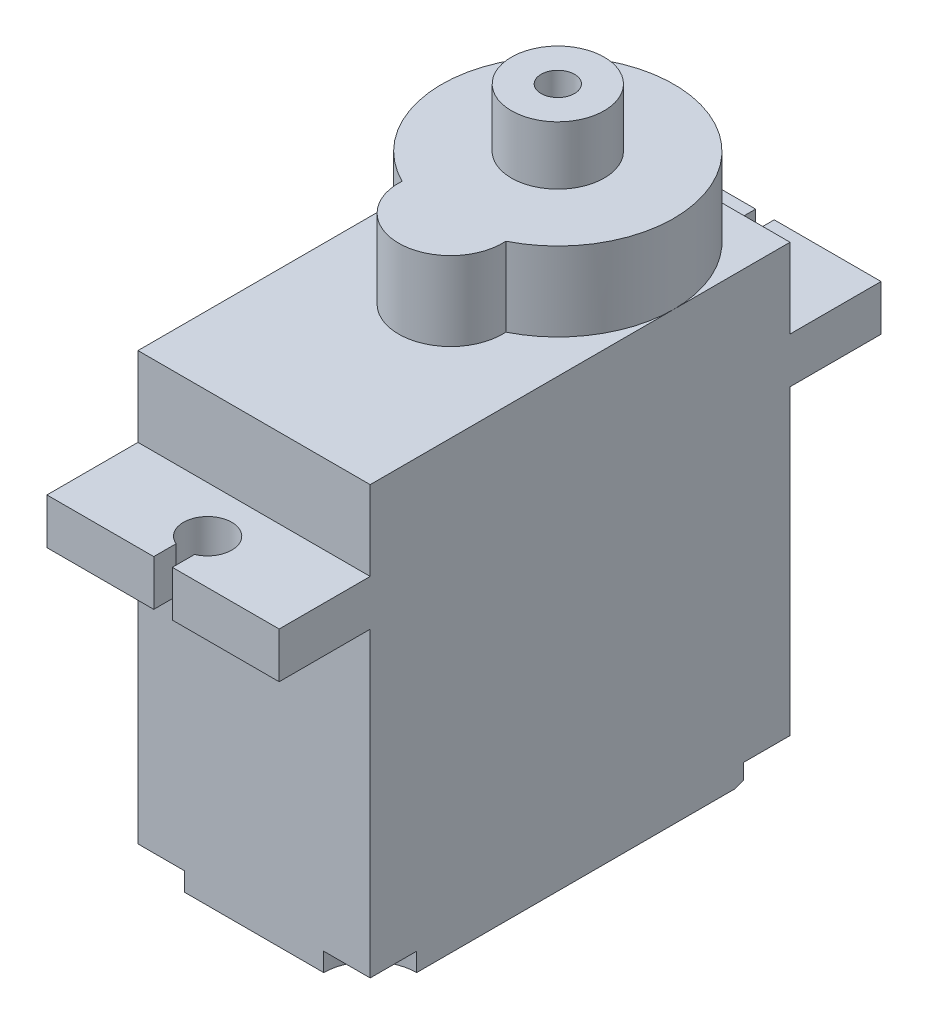
ISO-10303-21;
HEADER;
FILE_DESCRIPTION(('STEP AP214'),'2;1');
FILE_NAME('part.step','',(''),(''),'','','');
FILE_SCHEMA(('AUTOMOTIVE_DESIGN { 1 0 10303 214 1 1 1 1 }'));
ENDSEC;
DATA;
#1=APPLICATION_CONTEXT('core data for automotive mechanical design processes');
#2=APPLICATION_PROTOCOL_DEFINITION('international standard','automotive_design',2000,#1);
#3=PRODUCT_CONTEXT('',#1,'mechanical');
#4=PRODUCT('Part','Part','',(#3));
#5=PRODUCT_RELATED_PRODUCT_CATEGORY('part','',(#4));
#6=PRODUCT_DEFINITION_FORMATION('','',#4);
#7=PRODUCT_DEFINITION_CONTEXT('part definition',#1,'design');
#8=PRODUCT_DEFINITION('design','',#6,#7);
#9=PRODUCT_DEFINITION_SHAPE('','',#8);
#10=(LENGTH_UNIT() NAMED_UNIT(*) SI_UNIT(.MILLI.,.METRE.));
#11=(NAMED_UNIT(*) PLANE_ANGLE_UNIT() SI_UNIT($,.RADIAN.));
#12=(NAMED_UNIT(*) SI_UNIT($,.STERADIAN.) SOLID_ANGLE_UNIT());
#13=UNCERTAINTY_MEASURE_WITH_UNIT(LENGTH_MEASURE(1.E-05),#10,'distance_accuracy_value','');
#14=(GEOMETRIC_REPRESENTATION_CONTEXT(3) GLOBAL_UNCERTAINTY_ASSIGNED_CONTEXT((#13)) GLOBAL_UNIT_ASSIGNED_CONTEXT((#10,
#11,#12)) REPRESENTATION_CONTEXT('',''));
#15=CARTESIAN_POINT('',(0.,0.,0.));
#16=DIRECTION('',(0.,0.,1.));
#17=DIRECTION('',(1.,0.,0.));
#18=AXIS2_PLACEMENT_3D('',#15,#16,#17);
#19=CARTESIAN_POINT('',(6.25,4.28,11.3));
#20=DIRECTION('',(0.,-1.,0.));
#21=DIRECTION('',(0.,0.,-1.));
#22=AXIS2_PLACEMENT_3D('',#19,#20,#21);
#23=PLANE('',#22);
#24=CARTESIAN_POINT('',(0.,4.28,0.719999999999996));
#25=DIRECTION('',(0.,1.,0.));
#26=DIRECTION('',(0.,0.,1.));
#27=AXIS2_PLACEMENT_3D('',#24,#25,#26);
#28=CIRCLE('',#27,2.8);
#29=CARTESIAN_POINT('',(-2.79424619253468,4.28,0.540589254766044));
#30=VERTEX_POINT('',#29);
#31=CARTESIAN_POINT('',(2.79424619253469,4.28,0.54058925476604));
#32=VERTEX_POINT('',#31);
#33=EDGE_CURVE('E508',#30,#32,#28,.T.);
#34=ORIENTED_EDGE('',*,*,#33,.F.);
#35=CARTESIAN_POINT('',(0.,4.28000000000001,-5.04999999999999));
#36=DIRECTION('',(0.,1.,0.));
#37=DIRECTION('',(0.,0.,1.));
#38=AXIS2_PLACEMENT_3D('',#35,#36,#37);
#39=CIRCLE('',#38,6.25);
#40=CARTESIAN_POINT('',(-6.25,4.28000000000001,-5.04999999999999));
#41=VERTEX_POINT('',#40);
#42=EDGE_CURVE('E368',#41,#30,#39,.T.);
#43=ORIENTED_EDGE('',*,*,#42,.F.);
#44=DIRECTION('',(0.,0.,1.));
#45=VECTOR('',#44,1.);
#46=CARTESIAN_POINT('',(-6.25,4.28,11.3));
#47=LINE('',#46,#45);
#48=CARTESIAN_POINT('',(-6.25,4.28,11.3));
#49=VERTEX_POINT('',#48);
#50=EDGE_CURVE('E301',#41,#49,#47,.T.);
#51=ORIENTED_EDGE('',*,*,#50,.T.);
#52=DIRECTION('',(-1.,0.,0.));
#53=VECTOR('',#52,1.);
#54=CARTESIAN_POINT('',(6.25,4.28,11.3));
#55=LINE('',#54,#53);
#56=CARTESIAN_POINT('',(6.25,4.28,11.3));
#57=VERTEX_POINT('',#56);
#58=EDGE_CURVE('E307',#57,#49,#55,.T.);
#59=ORIENTED_EDGE('',*,*,#58,.F.);
#60=DIRECTION('',(0.,0.,1.));
#61=VECTOR('',#60,1.);
#62=CARTESIAN_POINT('',(6.25,4.28,11.3));
#63=LINE('',#62,#61);
#64=CARTESIAN_POINT('',(6.25,4.28000000000001,-5.04999999999999));
#65=VERTEX_POINT('',#64);
#66=EDGE_CURVE('E423',#65,#57,#63,.T.);
#67=ORIENTED_EDGE('',*,*,#66,.F.);
#68=EDGE_CURVE('E517',#32,#65,#39,.T.);
#69=ORIENTED_EDGE('',*,*,#68,.F.);
#70=EDGE_LOOP('',(#34,#43,#51,#59,#67,#69));
#71=FACE_BOUND('',#70,.T.);
#72=ADVANCED_FACE('F39',(#71),#23,.F.);
#73=CARTESIAN_POINT('',(0.,4.28000000000001,-11.3));
#74=VERTEX_POINT('',#73);
#75=EDGE_CURVE('E374',#65,#74,#39,.T.);
#76=ORIENTED_EDGE('',*,*,#75,.F.);
#77=CARTESIAN_POINT('',(6.25,4.28000000000001,-11.3));
#78=VERTEX_POINT('',#77);
#79=EDGE_CURVE('E312',#78,#65,#63,.T.);
#80=ORIENTED_EDGE('',*,*,#79,.F.);
#81=DIRECTION('',(-1.,0.,0.));
#82=VECTOR('',#81,1.);
#83=CARTESIAN_POINT('',(6.25,4.28000000000001,-11.3));
#84=LINE('',#83,#82);
#85=EDGE_CURVE('E313',#78,#74,#84,.T.);
#86=ORIENTED_EDGE('',*,*,#85,.T.);
#87=EDGE_LOOP('',(#76,#80,#86));
#88=FACE_BOUND('',#87,.T.);
#89=ADVANCED_FACE('F659',(#88),#23,.F.);
#90=CARTESIAN_POINT('',(6.25,0.,16.2));
#91=DIRECTION('',(0.,0.,-1.));
#92=DIRECTION('',(-1.,0.,0.));
#93=AXIS2_PLACEMENT_3D('',#90,#91,#92);
#94=PLANE('',#93);
#95=DIRECTION('',(-1.,0.,0.));
#96=VECTOR('',#95,1.);
#97=CARTESIAN_POINT('',(6.25,0.,16.2));
#98=LINE('',#97,#96);
#99=CARTESIAN_POINT('',(6.25,0.,16.2));
#100=VERTEX_POINT('',#99);
#101=CARTESIAN_POINT('',(0.5,0.,16.2));
#102=VERTEX_POINT('',#101);
#103=EDGE_CURVE('E348',#100,#102,#98,.T.);
#104=ORIENTED_EDGE('',*,*,#103,.T.);
#105=DIRECTION('',(0.,1.,0.));
#106=VECTOR('',#105,1.);
#107=CARTESIAN_POINT('',(0.5,-12.5,16.2));
#108=LINE('',#107,#106);
#109=CARTESIAN_POINT('',(0.5,-2.46,16.2));
#110=VERTEX_POINT('',#109);
#111=EDGE_CURVE('E574',#110,#102,#108,.T.);
#112=ORIENTED_EDGE('',*,*,#111,.F.);
#113=DIRECTION('',(-1.,0.,0.));
#114=VECTOR('',#113,1.);
#115=CARTESIAN_POINT('',(6.25,-2.46,16.2));
#116=LINE('',#115,#114);
#117=CARTESIAN_POINT('',(6.25,-2.46,16.2));
#118=VERTEX_POINT('',#117);
#119=EDGE_CURVE('E343',#118,#110,#116,.T.);
#120=ORIENTED_EDGE('',*,*,#119,.F.);
#121=DIRECTION('',(0.,-1.,0.));
#122=VECTOR('',#121,1.);
#123=CARTESIAN_POINT('',(6.25,0.,16.2));
#124=LINE('',#123,#122);
#125=EDGE_CURVE('E599',#100,#118,#124,.T.);
#126=ORIENTED_EDGE('',*,*,#125,.F.);
#127=EDGE_LOOP('',(#104,#112,#120,#126));
#128=FACE_BOUND('',#127,.T.);
#129=ADVANCED_FACE('F610',(#128),#94,.F.);
#130=CARTESIAN_POINT('',(6.25,0.,-16.2));
#131=DIRECTION('',(0.,0.,1.));
#132=DIRECTION('',(1.,0.,0.));
#133=AXIS2_PLACEMENT_3D('',#130,#131,#132);
#134=PLANE('',#133);
#135=DIRECTION('',(-1.,0.,0.));
#136=VECTOR('',#135,1.);
#137=CARTESIAN_POINT('',(6.25,0.,-16.2));
#138=LINE('',#137,#136);
#139=CARTESIAN_POINT('',(-0.5,0.,-16.2));
#140=VERTEX_POINT('',#139);
#141=CARTESIAN_POINT('',(-6.25,0.,-16.2));
#142=VERTEX_POINT('',#141);
#143=EDGE_CURVE('E321',#140,#142,#138,.T.);
#144=ORIENTED_EDGE('',*,*,#143,.F.);
#145=DIRECTION('',(0.,1.,0.));
#146=VECTOR('',#145,1.);
#147=CARTESIAN_POINT('',(-0.5,-12.5,-16.2));
#148=LINE('',#147,#146);
#149=CARTESIAN_POINT('',(-0.5,-2.46,-16.2));
#150=VERTEX_POINT('',#149);
#151=EDGE_CURVE('E551',#150,#140,#148,.T.);
#152=ORIENTED_EDGE('',*,*,#151,.F.);
#153=DIRECTION('',(-1.,0.,0.));
#154=VECTOR('',#153,1.);
#155=CARTESIAN_POINT('',(6.25,-2.46,-16.2));
#156=LINE('',#155,#154);
#157=CARTESIAN_POINT('',(-6.25,-2.46,-16.2));
#158=VERTEX_POINT('',#157);
#159=EDGE_CURVE('E326',#150,#158,#156,.T.);
#160=ORIENTED_EDGE('',*,*,#159,.T.);
#161=DIRECTION('',(0.,1.,0.));
#162=VECTOR('',#161,1.);
#163=CARTESIAN_POINT('',(-6.25,0.,-16.2));
#164=LINE('',#163,#162);
#165=EDGE_CURVE('E290',#158,#142,#164,.T.);
#166=ORIENTED_EDGE('',*,*,#165,.T.);
#167=EDGE_LOOP('',(#144,#152,#160,#166));
#168=FACE_BOUND('',#167,.T.);
#169=ADVANCED_FACE('F676',(#168),#134,.F.);
#170=CARTESIAN_POINT('',(6.25,4.28,11.3));
#171=DIRECTION('',(0.,0.,-1.));
#172=DIRECTION('',(0.,1.,0.));
#173=AXIS2_PLACEMENT_3D('',#170,#171,#172);
#174=PLANE('',#173);
#175=DIRECTION('',(0.,-1.,0.));
#176=VECTOR('',#175,1.);
#177=CARTESIAN_POINT('',(-6.25,4.28,11.3));
#178=LINE('',#177,#176);
#179=CARTESIAN_POINT('',(-6.25,0.,11.3));
#180=VERTEX_POINT('',#179);
#181=EDGE_CURVE('E427',#49,#180,#178,.T.);
#182=ORIENTED_EDGE('',*,*,#181,.T.);
#183=DIRECTION('',(-1.,0.,0.));
#184=VECTOR('',#183,1.);
#185=CARTESIAN_POINT('',(6.25,0.,11.3));
#186=LINE('',#185,#184);
#187=CARTESIAN_POINT('',(6.25,0.,11.3));
#188=VERTEX_POINT('',#187);
#189=EDGE_CURVE('E352',#188,#180,#186,.T.);
#190=ORIENTED_EDGE('',*,*,#189,.F.);
#191=DIRECTION('',(0.,-1.,0.));
#192=VECTOR('',#191,1.);
#193=CARTESIAN_POINT('',(6.25,4.28,11.3));
#194=LINE('',#193,#192);
#195=EDGE_CURVE('E306',#57,#188,#194,.T.);
#196=ORIENTED_EDGE('',*,*,#195,.F.);
#197=ORIENTED_EDGE('',*,*,#58,.T.);
#198=EDGE_LOOP('',(#182,#190,#196,#197));
#199=FACE_BOUND('',#198,.T.);
#200=ADVANCED_FACE('F41',(#199),#174,.F.);
#201=CARTESIAN_POINT('',(6.25,0.,11.3));
#202=DIRECTION('',(0.,-1.,0.));
#203=DIRECTION('',(0.,0.,-1.));
#204=AXIS2_PLACEMENT_3D('',#201,#202,#203);
#205=PLANE('',#204);
#206=CARTESIAN_POINT('',(0.,0.,13.8));
#207=DIRECTION('',(0.,1.,0.));
#208=DIRECTION('',(0.,0.,-1.));
#209=AXIS2_PLACEMENT_3D('',#206,#207,#208);
#210=CIRCLE('',#209,1.3);
#211=CARTESIAN_POINT('',(0.5,0.,15.));
#212=VERTEX_POINT('',#211);
#213=CARTESIAN_POINT('',(-0.5,0.,15.));
#214=VERTEX_POINT('',#213);
#215=EDGE_CURVE('E534',#212,#214,#210,.T.);
#216=ORIENTED_EDGE('',*,*,#215,.F.);
#217=DIRECTION('',(0.,0.,-1.));
#218=VECTOR('',#217,1.);
#219=CARTESIAN_POINT('',(0.5,0.,15.));
#220=LINE('',#219,#218);
#221=EDGE_CURVE('E567',#102,#212,#220,.T.);
#222=ORIENTED_EDGE('',*,*,#221,.F.);
#223=ORIENTED_EDGE('',*,*,#103,.F.);
#224=DIRECTION('',(0.,0.,1.));
#225=VECTOR('',#224,1.);
#226=CARTESIAN_POINT('',(6.25,0.,11.3));
#227=LINE('',#226,#225);
#228=EDGE_CURVE('E596',#188,#100,#227,.T.);
#229=ORIENTED_EDGE('',*,*,#228,.F.);
#230=ORIENTED_EDGE('',*,*,#189,.T.);
#231=DIRECTION('',(0.,0.,1.));
#232=VECTOR('',#231,1.);
#233=CARTESIAN_POINT('',(-6.25,0.,11.3));
#234=LINE('',#233,#232);
#235=CARTESIAN_POINT('',(-6.25,0.,16.2));
#236=VERTEX_POINT('',#235);
#237=EDGE_CURVE('E431',#180,#236,#234,.T.);
#238=ORIENTED_EDGE('',*,*,#237,.T.);
#239=CARTESIAN_POINT('',(-0.5,0.,16.2));
#240=VERTEX_POINT('',#239);
#241=EDGE_CURVE('E347',#240,#236,#98,.T.);
#242=ORIENTED_EDGE('',*,*,#241,.F.);
#243=DIRECTION('',(0.,0.,1.));
#244=VECTOR('',#243,1.);
#245=CARTESIAN_POINT('',(-0.5,0.,15.));
#246=LINE('',#245,#244);
#247=EDGE_CURVE('E564',#214,#240,#246,.T.);
#248=ORIENTED_EDGE('',*,*,#247,.F.);
#249=EDGE_LOOP('',(#216,#222,#223,#229,#230,#238,#242,#248));
#250=FACE_BOUND('',#249,.T.);
#251=ADVANCED_FACE('F618',(#250),#205,.F.);
#252=CARTESIAN_POINT('',(-0.5,-2.46,16.2));
#253=VERTEX_POINT('',#252);
#254=CARTESIAN_POINT('',(-6.25,-2.46,16.2));
#255=VERTEX_POINT('',#254);
#256=EDGE_CURVE('E342',#253,#255,#116,.T.);
#257=ORIENTED_EDGE('',*,*,#256,.F.);
#258=DIRECTION('',(0.,1.,0.));
#259=VECTOR('',#258,1.);
#260=CARTESIAN_POINT('',(-0.5,-12.5,16.2));
#261=LINE('',#260,#259);
#262=EDGE_CURVE('E577',#253,#240,#261,.T.);
#263=ORIENTED_EDGE('',*,*,#262,.T.);
#264=ORIENTED_EDGE('',*,*,#241,.T.);
#265=DIRECTION('',(0.,-1.,0.));
#266=VECTOR('',#265,1.);
#267=CARTESIAN_POINT('',(-6.25,0.,16.2));
#268=LINE('',#267,#266);
#269=EDGE_CURVE('E436',#236,#255,#268,.T.);
#270=ORIENTED_EDGE('',*,*,#269,.T.);
#271=EDGE_LOOP('',(#257,#263,#264,#270));
#272=FACE_BOUND('',#271,.T.);
#273=ADVANCED_FACE('F626',(#272),#94,.F.);
#274=CARTESIAN_POINT('',(6.25,-2.46,11.3));
#275=DIRECTION('',(0.,1.,0.));
#276=DIRECTION('',(0.,0.,1.));
#277=AXIS2_PLACEMENT_3D('',#274,#275,#276);
#278=PLANE('',#277);
#279=ORIENTED_EDGE('',*,*,#119,.T.);
#280=DIRECTION('',(0.,0.,-1.));
#281=VECTOR('',#280,1.);
#282=CARTESIAN_POINT('',(0.5,-2.46,11.3));
#283=LINE('',#282,#281);
#284=CARTESIAN_POINT('',(0.5,-2.46,15.));
#285=VERTEX_POINT('',#284);
#286=EDGE_CURVE('E364',#110,#285,#283,.T.);
#287=ORIENTED_EDGE('',*,*,#286,.T.);
#288=CARTESIAN_POINT('',(0.,-2.46,13.8));
#289=DIRECTION('',(0.,1.,0.));
#290=DIRECTION('',(0.,0.,1.));
#291=AXIS2_PLACEMENT_3D('',#288,#289,#290);
#292=CIRCLE('',#291,1.3);
#293=CARTESIAN_POINT('',(-0.5,-2.46,15.));
#294=VERTEX_POINT('',#293);
#295=EDGE_CURVE('E360',#285,#294,#292,.T.);
#296=ORIENTED_EDGE('',*,*,#295,.T.);
#297=DIRECTION('',(0.,0.,1.));
#298=VECTOR('',#297,1.);
#299=CARTESIAN_POINT('',(-0.5,-2.46,11.3));
#300=LINE('',#299,#298);
#301=EDGE_CURVE('E356',#294,#253,#300,.T.);
#302=ORIENTED_EDGE('',*,*,#301,.T.);
#303=ORIENTED_EDGE('',*,*,#256,.T.);
#304=DIRECTION('',(0.,0.,-1.));
#305=VECTOR('',#304,1.);
#306=CARTESIAN_POINT('',(-6.25,-2.46,11.3));
#307=LINE('',#306,#305);
#308=CARTESIAN_POINT('',(-6.25,-2.46,11.3));
#309=VERTEX_POINT('',#308);
#310=EDGE_CURVE('E283',#255,#309,#307,.T.);
#311=ORIENTED_EDGE('',*,*,#310,.T.);
#312=DIRECTION('',(-1.,0.,0.));
#313=VECTOR('',#312,1.);
#314=CARTESIAN_POINT('',(6.25,-2.46,11.3));
#315=LINE('',#314,#313);
#316=CARTESIAN_POINT('',(6.25,-2.46,11.3));
#317=VERTEX_POINT('',#316);
#318=EDGE_CURVE('E338',#317,#309,#315,.T.);
#319=ORIENTED_EDGE('',*,*,#318,.F.);
#320=DIRECTION('',(0.,0.,-1.));
#321=VECTOR('',#320,1.);
#322=CARTESIAN_POINT('',(6.25,-2.46,11.3));
#323=LINE('',#322,#321);
#324=EDGE_CURVE('E602',#118,#317,#323,.T.);
#325=ORIENTED_EDGE('',*,*,#324,.F.);
#326=EDGE_LOOP('',(#279,#287,#296,#302,#303,#311,#319,#325));
#327=FACE_BOUND('',#326,.T.);
#328=ADVANCED_FACE('F443',(#327),#278,.F.);
#329=CARTESIAN_POINT('',(6.25,-2.46,11.3));
#330=DIRECTION('',(0.,0.,-1.));
#331=DIRECTION('',(-1.,0.,0.));
#332=AXIS2_PLACEMENT_3D('',#329,#330,#331);
#333=PLANE('',#332);
#334=DIRECTION('',(1.,0.,0.));
#335=VECTOR('',#334,1.);
#336=CARTESIAN_POINT('',(6.25,-18.72,11.3));
#337=LINE('',#336,#335);
#338=CARTESIAN_POINT('',(-6.25,-18.72,11.3));
#339=VERTEX_POINT('',#338);
#340=CARTESIAN_POINT('',(-3.75,-18.72,11.3));
#341=VERTEX_POINT('',#340);
#342=EDGE_CURVE('E460',#339,#341,#337,.T.);
#343=ORIENTED_EDGE('',*,*,#342,.T.);
#344=DIRECTION('',(0.,-1.,0.));
#345=VECTOR('',#344,1.);
#346=CARTESIAN_POINT('',(-3.75,-18.72,11.3));
#347=LINE('',#346,#345);
#348=CARTESIAN_POINT('',(-3.75,-19.72,11.3));
#349=VERTEX_POINT('',#348);
#350=EDGE_CURVE('E464',#341,#349,#347,.T.);
#351=ORIENTED_EDGE('',*,*,#350,.T.);
#352=DIRECTION('',(-1.,0.,0.));
#353=VECTOR('',#352,1.);
#354=CARTESIAN_POINT('',(6.25,-19.72,11.3));
#355=LINE('',#354,#353);
#356=CARTESIAN_POINT('',(3.75,-19.72,11.3));
#357=VERTEX_POINT('',#356);
#358=EDGE_CURVE('E335',#357,#349,#355,.T.);
#359=ORIENTED_EDGE('',*,*,#358,.F.);
#360=DIRECTION('',(0.,-1.,0.));
#361=VECTOR('',#360,1.);
#362=CARTESIAN_POINT('',(3.75,-18.72,11.3));
#363=LINE('',#362,#361);
#364=CARTESIAN_POINT('',(3.75,-18.72,11.3));
#365=VERTEX_POINT('',#364);
#366=EDGE_CURVE('E493',#357,#365,#363,.F.);
#367=ORIENTED_EDGE('',*,*,#366,.T.);
#368=DIRECTION('',(-1.,0.,0.));
#369=VECTOR('',#368,1.);
#370=CARTESIAN_POINT('',(6.25,-18.72,11.3));
#371=LINE('',#370,#369);
#372=CARTESIAN_POINT('',(6.25,-18.72,11.3));
#373=VERTEX_POINT('',#372);
#374=EDGE_CURVE('E490',#373,#365,#371,.T.);
#375=ORIENTED_EDGE('',*,*,#374,.F.);
#376=DIRECTION('',(0.,-1.,0.));
#377=VECTOR('',#376,1.);
#378=CARTESIAN_POINT('',(6.25,-2.46,11.3));
#379=LINE('',#378,#377);
#380=EDGE_CURVE('E411',#317,#373,#379,.T.);
#381=ORIENTED_EDGE('',*,*,#380,.F.);
#382=ORIENTED_EDGE('',*,*,#318,.T.);
#383=DIRECTION('',(0.,-1.,0.));
#384=VECTOR('',#383,1.);
#385=CARTESIAN_POINT('',(-6.25,-2.46,11.3));
#386=LINE('',#385,#384);
#387=EDGE_CURVE('E276',#309,#339,#386,.T.);
#388=ORIENTED_EDGE('',*,*,#387,.T.);
#389=EDGE_LOOP('',(#343,#351,#359,#367,#375,#381,#382,#388));
#390=FACE_BOUND('',#389,.T.);
#391=ADVANCED_FACE('F451',(#390),#333,.F.);
#392=CARTESIAN_POINT('',(6.25,-19.72,11.3));
#393=DIRECTION('',(0.,1.,0.));
#394=DIRECTION('',(0.,0.,1.));
#395=AXIS2_PLACEMENT_3D('',#392,#393,#394);
#396=PLANE('',#395);
#397=DIRECTION('',(0.,0.,-1.));
#398=VECTOR('',#397,1.);
#399=CARTESIAN_POINT('',(-6.25,-19.72,11.3));
#400=LINE('',#399,#398);
#401=CARTESIAN_POINT('',(-6.25,-19.72,8.8));
#402=VERTEX_POINT('',#401);
#403=CARTESIAN_POINT('',(-6.25,-19.72,-8.3));
#404=VERTEX_POINT('',#403);
#405=EDGE_CURVE('E265',#402,#404,#400,.T.);
#406=ORIENTED_EDGE('',*,*,#405,.T.);
#407=DIRECTION('',(-1.,0.,0.));
#408=VECTOR('',#407,1.);
#409=CARTESIAN_POINT('',(9.41227766016838,-19.72,-8.3));
#410=LINE('',#409,#408);
#411=CARTESIAN_POINT('',(6.25,-19.72,-8.3));
#412=VERTEX_POINT('',#411);
#413=EDGE_CURVE('E246',#412,#404,#410,.T.);
#414=ORIENTED_EDGE('',*,*,#413,.F.);
#415=DIRECTION('',(0.,0.,-1.));
#416=VECTOR('',#415,1.);
#417=CARTESIAN_POINT('',(6.25,-19.72,11.3));
#418=LINE('',#417,#416);
#419=CARTESIAN_POINT('',(6.25,-19.72,8.8));
#420=VERTEX_POINT('',#419);
#421=EDGE_CURVE('E405',#420,#412,#418,.T.);
#422=ORIENTED_EDGE('',*,*,#421,.F.);
#423=CARTESIAN_POINT('',(6.25,-19.72,11.3));
#424=DIRECTION('',(0.,-1.,0.));
#425=DIRECTION('',(0.,0.,-1.));
#426=AXIS2_PLACEMENT_3D('',#423,#424,#425);
#427=CIRCLE('',#426,2.5);
#428=EDGE_CURVE('E480',#357,#420,#427,.T.);
#429=ORIENTED_EDGE('',*,*,#428,.F.);
#430=ORIENTED_EDGE('',*,*,#358,.T.);
#431=CARTESIAN_POINT('',(-6.25,-19.72,11.3));
#432=DIRECTION('',(0.,-1.,0.));
#433=DIRECTION('',(0.,0.,1.));
#434=AXIS2_PLACEMENT_3D('',#431,#432,#433);
#435=CIRCLE('',#434,2.5);
#436=EDGE_CURVE('E273',#402,#349,#435,.T.);
#437=ORIENTED_EDGE('',*,*,#436,.F.);
#438=EDGE_LOOP('',(#406,#414,#422,#429,#430,#437));
#439=FACE_BOUND('',#438,.T.);
#440=ADVANCED_FACE('F271',(#439),#396,.F.);
#441=CARTESIAN_POINT('',(6.25,-2.46,-11.3));
#442=DIRECTION('',(0.,0.,1.));
#443=DIRECTION('',(0.,-1.,0.));
#444=AXIS2_PLACEMENT_3D('',#441,#442,#443);
#445=PLANE('',#444);
#446=DIRECTION('',(-1.,0.,0.));
#447=VECTOR('',#446,1.);
#448=CARTESIAN_POINT('',(6.25,-18.72,-11.3));
#449=LINE('',#448,#447);
#450=CARTESIAN_POINT('',(6.25,-18.72,-11.3));
#451=VERTEX_POINT('',#450);
#452=CARTESIAN_POINT('',(3.75,-18.72,-11.3));
#453=VERTEX_POINT('',#452);
#454=EDGE_CURVE('E63',#451,#453,#449,.T.);
#455=ORIENTED_EDGE('',*,*,#454,.T.);
#456=DIRECTION('',(-1.,0.,0.));
#457=VECTOR('',#456,1.);
#458=CARTESIAN_POINT('',(9.41227766016838,-18.72,-11.3));
#459=LINE('',#458,#457);
#460=CARTESIAN_POINT('',(-3.75,-18.72,-11.3));
#461=VERTEX_POINT('',#460);
#462=EDGE_CURVE('E258',#453,#461,#459,.T.);
#463=ORIENTED_EDGE('',*,*,#462,.T.);
#464=DIRECTION('',(1.,0.,0.));
#465=VECTOR('',#464,1.);
#466=CARTESIAN_POINT('',(6.25,-18.72,-11.3));
#467=LINE('',#466,#465);
#468=CARTESIAN_POINT('',(-6.25,-18.72,-11.3));
#469=VERTEX_POINT('',#468);
#470=EDGE_CURVE('E479',#469,#461,#467,.T.);
#471=ORIENTED_EDGE('',*,*,#470,.F.);
#472=DIRECTION('',(0.,1.,0.));
#473=VECTOR('',#472,1.);
#474=CARTESIAN_POINT('',(-6.25,-2.46,-11.3));
#475=LINE('',#474,#473);
#476=CARTESIAN_POINT('',(-6.25,-2.46,-11.3));
#477=VERTEX_POINT('',#476);
#478=EDGE_CURVE('E275',#469,#477,#475,.T.);
#479=ORIENTED_EDGE('',*,*,#478,.T.);
#480=DIRECTION('',(-1.,0.,0.));
#481=VECTOR('',#480,1.);
#482=CARTESIAN_POINT('',(6.25,-2.46,-11.3));
#483=LINE('',#482,#481);
#484=CARTESIAN_POINT('',(6.25,-2.46,-11.3));
#485=VERTEX_POINT('',#484);
#486=EDGE_CURVE('E331',#485,#477,#483,.T.);
#487=ORIENTED_EDGE('',*,*,#486,.F.);
#488=DIRECTION('',(0.,1.,0.));
#489=VECTOR('',#488,1.);
#490=CARTESIAN_POINT('',(6.25,-2.46,-11.3));
#491=LINE('',#490,#489);
#492=EDGE_CURVE('E395',#451,#485,#491,.T.);
#493=ORIENTED_EDGE('',*,*,#492,.F.);
#494=EDGE_LOOP('',(#455,#463,#471,#479,#487,#493));
#495=FACE_BOUND('',#494,.T.);
#496=ADVANCED_FACE('F400',(#495),#445,.F.);
#497=CARTESIAN_POINT('',(6.25,-2.46,-11.3));
#498=DIRECTION('',(0.,1.,0.));
#499=DIRECTION('',(0.,0.,1.));
#500=AXIS2_PLACEMENT_3D('',#497,#498,#499);
#501=PLANE('',#500);
#502=ORIENTED_EDGE('',*,*,#159,.F.);
#503=DIRECTION('',(0.,0.,1.));
#504=VECTOR('',#503,1.);
#505=CARTESIAN_POINT('',(-0.5,-2.46,-11.3));
#506=LINE('',#505,#504);
#507=CARTESIAN_POINT('',(-0.5,-2.46,-15.));
#508=VERTEX_POINT('',#507);
#509=EDGE_CURVE('E586',#150,#508,#506,.T.);
#510=ORIENTED_EDGE('',*,*,#509,.T.);
#511=CARTESIAN_POINT('',(0.,-2.46,-13.8));
#512=DIRECTION('',(0.,1.,0.));
#513=DIRECTION('',(0.,0.,1.));
#514=AXIS2_PLACEMENT_3D('',#511,#512,#513);
#515=CIRCLE('',#514,1.3);
#516=CARTESIAN_POINT('',(0.5,-2.46,-15.));
#517=VERTEX_POINT('',#516);
#518=EDGE_CURVE('E432',#508,#517,#515,.T.);
#519=ORIENTED_EDGE('',*,*,#518,.T.);
#520=DIRECTION('',(0.,0.,-1.));
#521=VECTOR('',#520,1.);
#522=CARTESIAN_POINT('',(0.5,-2.46,-11.3));
#523=LINE('',#522,#521);
#524=CARTESIAN_POINT('',(0.5,-2.46,-16.2));
#525=VERTEX_POINT('',#524);
#526=EDGE_CURVE('E550',#517,#525,#523,.T.);
#527=ORIENTED_EDGE('',*,*,#526,.T.);
#528=CARTESIAN_POINT('',(6.25,-2.46,-16.2));
#529=VERTEX_POINT('',#528);
#530=EDGE_CURVE('E327',#529,#525,#156,.T.);
#531=ORIENTED_EDGE('',*,*,#530,.F.);
#532=DIRECTION('',(0.,0.,-1.));
#533=VECTOR('',#532,1.);
#534=CARTESIAN_POINT('',(6.25,-2.46,-11.3));
#535=LINE('',#534,#533);
#536=EDGE_CURVE('E404',#485,#529,#535,.T.);
#537=ORIENTED_EDGE('',*,*,#536,.F.);
#538=ORIENTED_EDGE('',*,*,#486,.T.);
#539=DIRECTION('',(0.,0.,-1.));
#540=VECTOR('',#539,1.);
#541=CARTESIAN_POINT('',(-6.25,-2.46,-11.3));
#542=LINE('',#541,#540);
#543=EDGE_CURVE('E280',#477,#158,#542,.T.);
#544=ORIENTED_EDGE('',*,*,#543,.T.);
#545=EDGE_LOOP('',(#502,#510,#519,#527,#531,#537,#538,#544));
#546=FACE_BOUND('',#545,.T.);
#547=ADVANCED_FACE('F679',(#546),#501,.F.);
#548=ORIENTED_EDGE('',*,*,#530,.T.);
#549=DIRECTION('',(0.,1.,0.));
#550=VECTOR('',#549,1.);
#551=CARTESIAN_POINT('',(0.5,-12.5,-16.2));
#552=LINE('',#551,#550);
#553=CARTESIAN_POINT('',(0.5,0.,-16.2));
#554=VERTEX_POINT('',#553);
#555=EDGE_CURVE('E554',#525,#554,#552,.T.);
#556=ORIENTED_EDGE('',*,*,#555,.T.);
#557=CARTESIAN_POINT('',(6.25,0.,-16.2));
#558=VERTEX_POINT('',#557);
#559=EDGE_CURVE('E322',#558,#554,#138,.T.);
#560=ORIENTED_EDGE('',*,*,#559,.F.);
#561=DIRECTION('',(0.,1.,0.));
#562=VECTOR('',#561,1.);
#563=CARTESIAN_POINT('',(6.25,0.,-16.2));
#564=LINE('',#563,#562);
#565=EDGE_CURVE('E409',#529,#558,#564,.T.);
#566=ORIENTED_EDGE('',*,*,#565,.F.);
#567=EDGE_LOOP('',(#548,#556,#560,#566));
#568=FACE_BOUND('',#567,.T.);
#569=ADVANCED_FACE('F731',(#568),#134,.F.);
#570=CARTESIAN_POINT('',(6.25,0.,-11.3));
#571=DIRECTION('',(0.,-1.,0.));
#572=DIRECTION('',(0.,0.,-1.));
#573=AXIS2_PLACEMENT_3D('',#570,#571,#572);
#574=PLANE('',#573);
#575=CARTESIAN_POINT('',(0.,0.,-13.8));
#576=DIRECTION('',(0.,1.,0.));
#577=DIRECTION('',(0.,0.,1.));
#578=AXIS2_PLACEMENT_3D('',#575,#576,#577);
#579=CIRCLE('',#578,1.3);
#580=CARTESIAN_POINT('',(-0.5,0.,-15.));
#581=VERTEX_POINT('',#580);
#582=CARTESIAN_POINT('',(0.500000000000001,0.,-15.));
#583=VERTEX_POINT('',#582);
#584=EDGE_CURVE('E535',#581,#583,#579,.T.);
#585=ORIENTED_EDGE('',*,*,#584,.F.);
#586=DIRECTION('',(0.,0.,1.));
#587=VECTOR('',#586,1.);
#588=CARTESIAN_POINT('',(-0.5,0.,-15.));
#589=LINE('',#588,#587);
#590=EDGE_CURVE('E542',#140,#581,#589,.T.);
#591=ORIENTED_EDGE('',*,*,#590,.F.);
#592=ORIENTED_EDGE('',*,*,#143,.T.);
#593=DIRECTION('',(0.,0.,1.));
#594=VECTOR('',#593,1.);
#595=CARTESIAN_POINT('',(-6.25,0.,-11.3));
#596=LINE('',#595,#594);
#597=CARTESIAN_POINT('',(-6.25,0.,-11.3));
#598=VERTEX_POINT('',#597);
#599=EDGE_CURVE('E294',#142,#598,#596,.T.);
#600=ORIENTED_EDGE('',*,*,#599,.T.);
#601=DIRECTION('',(-1.,0.,0.));
#602=VECTOR('',#601,1.);
#603=CARTESIAN_POINT('',(6.25,0.,-11.3));
#604=LINE('',#603,#602);
#605=CARTESIAN_POINT('',(6.25,0.,-11.3));
#606=VERTEX_POINT('',#605);
#607=EDGE_CURVE('E317',#606,#598,#604,.T.);
#608=ORIENTED_EDGE('',*,*,#607,.F.);
#609=DIRECTION('',(0.,0.,1.));
#610=VECTOR('',#609,1.);
#611=CARTESIAN_POINT('',(6.25,0.,-11.3));
#612=LINE('',#611,#610);
#613=EDGE_CURVE('E417',#558,#606,#612,.T.);
#614=ORIENTED_EDGE('',*,*,#613,.F.);
#615=ORIENTED_EDGE('',*,*,#559,.T.);
#616=DIRECTION('',(0.,0.,-1.));
#617=VECTOR('',#616,1.);
#618=CARTESIAN_POINT('',(0.5,0.,-15.));
#619=LINE('',#618,#617);
#620=EDGE_CURVE('E538',#583,#554,#619,.T.);
#621=ORIENTED_EDGE('',*,*,#620,.F.);
#622=EDGE_LOOP('',(#585,#591,#592,#600,#608,#614,#615,#621));
#623=FACE_BOUND('',#622,.T.);
#624=ADVANCED_FACE('F670',(#623),#574,.F.);
#625=CARTESIAN_POINT('',(6.25,4.28000000000001,-11.3));
#626=DIRECTION('',(0.,0.,1.));
#627=DIRECTION('',(0.,-1.,0.));
#628=AXIS2_PLACEMENT_3D('',#625,#626,#627);
#629=PLANE('',#628);
#630=DIRECTION('',(0.,1.,0.));
#631=VECTOR('',#630,1.);
#632=CARTESIAN_POINT('',(-6.25,4.28000000000001,-11.3));
#633=LINE('',#632,#631);
#634=CARTESIAN_POINT('',(-6.25,4.28000000000001,-11.3));
#635=VERTEX_POINT('',#634);
#636=EDGE_CURVE('E297',#598,#635,#633,.T.);
#637=ORIENTED_EDGE('',*,*,#636,.T.);
#638=EDGE_CURVE('E311',#74,#635,#84,.T.);
#639=ORIENTED_EDGE('',*,*,#638,.F.);
#640=ORIENTED_EDGE('',*,*,#85,.F.);
#641=DIRECTION('',(0.,1.,0.));
#642=VECTOR('',#641,1.);
#643=CARTESIAN_POINT('',(6.25,4.28000000000001,-11.3));
#644=LINE('',#643,#642);
#645=EDGE_CURVE('E420',#606,#78,#644,.T.);
#646=ORIENTED_EDGE('',*,*,#645,.F.);
#647=ORIENTED_EDGE('',*,*,#607,.T.);
#648=EDGE_LOOP('',(#637,#639,#640,#646,#647));
#649=FACE_BOUND('',#648,.T.);
#650=ADVANCED_FACE('F663',(#649),#629,.F.);
#651=EDGE_CURVE('E648',#74,#41,#39,.T.);
#652=ORIENTED_EDGE('',*,*,#651,.F.);
#653=ORIENTED_EDGE('',*,*,#638,.T.);
#654=EDGE_CURVE('E302',#635,#41,#47,.T.);
#655=ORIENTED_EDGE('',*,*,#654,.T.);
#656=EDGE_LOOP('',(#652,#653,#655));
#657=FACE_BOUND('',#656,.T.);
#658=ADVANCED_FACE('F647',(#657),#23,.F.);
#659=CARTESIAN_POINT('',(6.25,0.,0.));
#660=DIRECTION('',(-1.,0.,0.));
#661=DIRECTION('',(0.,0.,1.));
#662=AXIS2_PLACEMENT_3D('',#659,#660,#661);
#663=PLANE('',#662);
#664=ORIENTED_EDGE('',*,*,#421,.T.);
#665=DIRECTION('',(0.,-0.316227766016838,0.948683298050514));
#666=VECTOR('',#665,1.);
#667=CARTESIAN_POINT('',(6.25,-19.72,-8.3));
#668=LINE('',#667,#666);
#669=CARTESIAN_POINT('',(6.25,-19.5533333333333,-8.8));
#670=VERTEX_POINT('',#669);
#671=EDGE_CURVE('E252',#670,#412,#668,.T.);
#672=ORIENTED_EDGE('',*,*,#671,.F.);
#673=DIRECTION('',(0.,-1.,0.));
#674=VECTOR('',#673,1.);
#675=CARTESIAN_POINT('',(6.25,-18.72,-8.8));
#676=LINE('',#675,#674);
#677=CARTESIAN_POINT('',(6.25,-18.72,-8.8));
#678=VERTEX_POINT('',#677);
#679=EDGE_CURVE('E11',#670,#678,#676,.F.);
#680=ORIENTED_EDGE('',*,*,#679,.T.);
#681=DIRECTION('',(0.,0.,-1.));
#682=VECTOR('',#681,1.);
#683=CARTESIAN_POINT('',(6.25,-18.72,0.));
#684=LINE('',#683,#682);
#685=EDGE_CURVE('E48',#678,#451,#684,.T.);
#686=ORIENTED_EDGE('',*,*,#685,.T.);
#687=ORIENTED_EDGE('',*,*,#492,.T.);
#688=ORIENTED_EDGE('',*,*,#536,.T.);
#689=ORIENTED_EDGE('',*,*,#565,.T.);
#690=ORIENTED_EDGE('',*,*,#613,.T.);
#691=ORIENTED_EDGE('',*,*,#645,.T.);
#692=ORIENTED_EDGE('',*,*,#79,.T.);
#693=ORIENTED_EDGE('',*,*,#66,.T.);
#694=ORIENTED_EDGE('',*,*,#195,.T.);
#695=ORIENTED_EDGE('',*,*,#228,.T.);
#696=ORIENTED_EDGE('',*,*,#125,.T.);
#697=ORIENTED_EDGE('',*,*,#324,.T.);
#698=ORIENTED_EDGE('',*,*,#380,.T.);
#699=DIRECTION('',(0.,0.,1.));
#700=VECTOR('',#699,1.);
#701=CARTESIAN_POINT('',(6.25,-18.72,0.));
#702=LINE('',#701,#700);
#703=CARTESIAN_POINT('',(6.25,-18.72,8.8));
#704=VERTEX_POINT('',#703);
#705=EDGE_CURVE('E385',#704,#373,#702,.T.);
#706=ORIENTED_EDGE('',*,*,#705,.F.);
#707=DIRECTION('',(0.,-1.,0.));
#708=VECTOR('',#707,1.);
#709=CARTESIAN_POINT('',(6.25,-18.72,8.8));
#710=LINE('',#709,#708);
#711=EDGE_CURVE('E388',#704,#420,#710,.T.);
#712=ORIENTED_EDGE('',*,*,#711,.T.);
#713=EDGE_LOOP('',(#664,#672,#680,#686,#687,#688,#689,#690,#691,#692,#693,#694,#695,#696,#697,
#698,#706,#712));
#714=FACE_BOUND('',#713,.T.);
#715=ADVANCED_FACE('F394',(#714),#663,.F.);
#716=CARTESIAN_POINT('',(-6.25,0.,0.));
#717=DIRECTION('',(-1.,0.,0.));
#718=DIRECTION('',(0.,0.,1.));
#719=AXIS2_PLACEMENT_3D('',#716,#717,#718);
#720=PLANE('',#719);
#721=DIRECTION('',(0.,0.316227766016838,-0.948683298050514));
#722=VECTOR('',#721,1.);
#723=CARTESIAN_POINT('',(-6.25,-19.72,-8.3));
#724=LINE('',#723,#722);
#725=CARTESIAN_POINT('',(-6.25,-19.5533333333333,-8.8));
#726=VERTEX_POINT('',#725);
#727=EDGE_CURVE('E249',#404,#726,#724,.T.);
#728=ORIENTED_EDGE('',*,*,#727,.F.);
#729=ORIENTED_EDGE('',*,*,#405,.F.);
#730=DIRECTION('',(0.,-1.,0.));
#731=VECTOR('',#730,1.);
#732=CARTESIAN_POINT('',(-6.25,-18.72,8.8));
#733=LINE('',#732,#731);
#734=CARTESIAN_POINT('',(-6.25,-18.72,8.8));
#735=VERTEX_POINT('',#734);
#736=EDGE_CURVE('E382',#735,#402,#733,.T.);
#737=ORIENTED_EDGE('',*,*,#736,.F.);
#738=DIRECTION('',(0.,0.,-1.));
#739=VECTOR('',#738,1.);
#740=CARTESIAN_POINT('',(-6.25,-18.72,0.));
#741=LINE('',#740,#739);
#742=EDGE_CURVE('E379',#339,#735,#741,.T.);
#743=ORIENTED_EDGE('',*,*,#742,.F.);
#744=ORIENTED_EDGE('',*,*,#387,.F.);
#745=ORIENTED_EDGE('',*,*,#310,.F.);
#746=ORIENTED_EDGE('',*,*,#269,.F.);
#747=ORIENTED_EDGE('',*,*,#237,.F.);
#748=ORIENTED_EDGE('',*,*,#181,.F.);
#749=ORIENTED_EDGE('',*,*,#50,.F.);
#750=ORIENTED_EDGE('',*,*,#654,.F.);
#751=ORIENTED_EDGE('',*,*,#636,.F.);
#752=ORIENTED_EDGE('',*,*,#599,.F.);
#753=ORIENTED_EDGE('',*,*,#165,.F.);
#754=ORIENTED_EDGE('',*,*,#543,.F.);
#755=ORIENTED_EDGE('',*,*,#478,.F.);
#756=DIRECTION('',(0.,0.,1.));
#757=VECTOR('',#756,1.);
#758=CARTESIAN_POINT('',(-6.25,-18.72,0.));
#759=LINE('',#758,#757);
#760=CARTESIAN_POINT('',(-6.25,-18.72,-8.8));
#761=VERTEX_POINT('',#760);
#762=EDGE_CURVE('E373',#469,#761,#759,.T.);
#763=ORIENTED_EDGE('',*,*,#762,.T.);
#764=DIRECTION('',(0.,-1.,0.));
#765=VECTOR('',#764,1.);
#766=CARTESIAN_POINT('',(-6.25,-18.72,-8.8));
#767=LINE('',#766,#765);
#768=EDGE_CURVE('E267',#726,#761,#767,.F.);
#769=ORIENTED_EDGE('',*,*,#768,.F.);
#770=EDGE_LOOP('',(#728,#729,#737,#743,#744,#745,#746,#747,#748,#749,#750,#751,#752,#753,#754,
#755,#763,#769));
#771=FACE_BOUND('',#770,.T.);
#772=ADVANCED_FACE('F263',(#771),#720,.T.);
#773=CARTESIAN_POINT('',(0.,-12.5,-13.8));
#774=DIRECTION('',(0.,1.,0.));
#775=DIRECTION('',(0.,0.,1.));
#776=AXIS2_PLACEMENT_3D('',#773,#774,#775);
#777=CYLINDRICAL_SURFACE('',#776,1.3);
#778=DIRECTION('',(0.,1.,0.));
#779=VECTOR('',#778,1.);
#780=CARTESIAN_POINT('',(-0.5,-12.5,-15.));
#781=LINE('',#780,#779);
#782=EDGE_CURVE('E547',#508,#581,#781,.T.);
#783=ORIENTED_EDGE('',*,*,#782,.T.);
#784=ORIENTED_EDGE('',*,*,#584,.T.);
#785=DIRECTION('',(0.,1.,0.));
#786=VECTOR('',#785,1.);
#787=CARTESIAN_POINT('',(0.5,-12.5,-15.));
#788=LINE('',#787,#786);
#789=EDGE_CURVE('E546',#517,#583,#788,.T.);
#790=ORIENTED_EDGE('',*,*,#789,.F.);
#791=ORIENTED_EDGE('',*,*,#518,.F.);
#792=EDGE_LOOP('',(#783,#784,#790,#791));
#793=FACE_BOUND('',#792,.T.);
#794=ADVANCED_FACE('F910',(#793),#777,.F.);
#795=CARTESIAN_POINT('',(-0.5,-12.5,-15.));
#796=DIRECTION('',(-1.,0.,0.));
#797=DIRECTION('',(0.,0.,1.));
#798=AXIS2_PLACEMENT_3D('',#795,#796,#797);
#799=PLANE('',#798);
#800=ORIENTED_EDGE('',*,*,#151,.T.);
#801=ORIENTED_EDGE('',*,*,#590,.T.);
#802=ORIENTED_EDGE('',*,*,#782,.F.);
#803=ORIENTED_EDGE('',*,*,#509,.F.);
#804=EDGE_LOOP('',(#800,#801,#802,#803));
#805=FACE_BOUND('',#804,.T.);
#806=ADVANCED_FACE('F952',(#805),#799,.F.);
#807=CARTESIAN_POINT('',(0.5,-12.5,-15.));
#808=DIRECTION('',(1.,0.,0.));
#809=DIRECTION('',(0.,0.,-1.));
#810=AXIS2_PLACEMENT_3D('',#807,#808,#809);
#811=PLANE('',#810);
#812=ORIENTED_EDGE('',*,*,#789,.T.);
#813=ORIENTED_EDGE('',*,*,#620,.T.);
#814=ORIENTED_EDGE('',*,*,#555,.F.);
#815=ORIENTED_EDGE('',*,*,#526,.F.);
#816=EDGE_LOOP('',(#812,#813,#814,#815));
#817=FACE_BOUND('',#816,.T.);
#818=ADVANCED_FACE('F961',(#817),#811,.F.);
#819=CARTESIAN_POINT('',(0.,-12.5,13.8));
#820=DIRECTION('',(0.,1.,0.));
#821=DIRECTION('',(0.,0.,1.));
#822=AXIS2_PLACEMENT_3D('',#819,#820,#821);
#823=CYLINDRICAL_SURFACE('',#822,1.3);
#824=DIRECTION('',(0.,1.,0.));
#825=VECTOR('',#824,1.);
#826=CARTESIAN_POINT('',(0.5,-12.5,15.));
#827=LINE('',#826,#825);
#828=EDGE_CURVE('E539',#285,#212,#827,.T.);
#829=ORIENTED_EDGE('',*,*,#828,.T.);
#830=ORIENTED_EDGE('',*,*,#215,.T.);
#831=DIRECTION('',(0.,1.,0.));
#832=VECTOR('',#831,1.);
#833=CARTESIAN_POINT('',(-0.5,-12.5,15.));
#834=LINE('',#833,#832);
#835=EDGE_CURVE('E571',#294,#214,#834,.T.);
#836=ORIENTED_EDGE('',*,*,#835,.F.);
#837=ORIENTED_EDGE('',*,*,#295,.F.);
#838=EDGE_LOOP('',(#829,#830,#836,#837));
#839=FACE_BOUND('',#838,.T.);
#840=ADVANCED_FACE('F623',(#839),#823,.F.);
#841=CARTESIAN_POINT('',(0.5,-12.5,15.));
#842=DIRECTION('',(1.,0.,0.));
#843=DIRECTION('',(0.,0.,-1.));
#844=AXIS2_PLACEMENT_3D('',#841,#842,#843);
#845=PLANE('',#844);
#846=ORIENTED_EDGE('',*,*,#111,.T.);
#847=ORIENTED_EDGE('',*,*,#221,.T.);
#848=ORIENTED_EDGE('',*,*,#828,.F.);
#849=ORIENTED_EDGE('',*,*,#286,.F.);
#850=EDGE_LOOP('',(#846,#847,#848,#849));
#851=FACE_BOUND('',#850,.T.);
#852=ADVANCED_FACE('F614',(#851),#845,.F.);
#853=CARTESIAN_POINT('',(-0.5,-12.5,15.));
#854=DIRECTION('',(-1.,0.,0.));
#855=DIRECTION('',(0.,0.,1.));
#856=AXIS2_PLACEMENT_3D('',#853,#854,#855);
#857=PLANE('',#856);
#858=ORIENTED_EDGE('',*,*,#835,.T.);
#859=ORIENTED_EDGE('',*,*,#247,.T.);
#860=ORIENTED_EDGE('',*,*,#262,.F.);
#861=ORIENTED_EDGE('',*,*,#301,.F.);
#862=EDGE_LOOP('',(#858,#859,#860,#861));
#863=FACE_BOUND('',#862,.T.);
#864=ADVANCED_FACE('F788',(#863),#857,.F.);
#865=CARTESIAN_POINT('',(0.,8.52,0.719999999999997));
#866=DIRECTION('',(0.,-1.,0.));
#867=DIRECTION('',(0.,0.,-1.));
#868=AXIS2_PLACEMENT_3D('',#865,#866,#867);
#869=CYLINDRICAL_SURFACE('',#868,2.8);
#870=ORIENTED_EDGE('',*,*,#33,.T.);
#871=DIRECTION('',(0.,-1.,0.));
#872=VECTOR('',#871,1.);
#873=CARTESIAN_POINT('',(2.79424619253469,8.52,0.540589254766041));
#874=LINE('',#873,#872);
#875=CARTESIAN_POINT('',(2.79424619253469,8.52,0.540589254766041));
#876=VERTEX_POINT('',#875);
#877=EDGE_CURVE('E530',#876,#32,#874,.T.);
#878=ORIENTED_EDGE('',*,*,#877,.F.);
#879=CARTESIAN_POINT('',(0.,8.52,0.719999999999997));
#880=DIRECTION('',(0.,1.,0.));
#881=DIRECTION('',(0.,0.,1.));
#882=AXIS2_PLACEMENT_3D('',#879,#880,#881);
#883=CIRCLE('',#882,2.8);
#884=CARTESIAN_POINT('',(-2.79424619253468,8.52,0.540589254766045));
#885=VERTEX_POINT('',#884);
#886=EDGE_CURVE('E512',#885,#876,#883,.T.);
#887=ORIENTED_EDGE('',*,*,#886,.F.);
#888=DIRECTION('',(0.,-1.,0.));
#889=VECTOR('',#888,1.);
#890=CARTESIAN_POINT('',(-2.79424619253468,8.52,0.540589254766045));
#891=LINE('',#890,#889);
#892=EDGE_CURVE('E520',#885,#30,#891,.T.);
#893=ORIENTED_EDGE('',*,*,#892,.T.);
#894=EDGE_LOOP('',(#870,#878,#887,#893));
#895=FACE_BOUND('',#894,.T.);
#896=ADVANCED_FACE('F783',(#895),#869,.T.);
#897=CARTESIAN_POINT('',(0.,8.52,-5.04999999999999));
#898=DIRECTION('',(0.,-1.,0.));
#899=DIRECTION('',(0.,0.,-1.));
#900=AXIS2_PLACEMENT_3D('',#897,#898,#899);
#901=CYLINDRICAL_SURFACE('',#900,6.25);
#902=ORIENTED_EDGE('',*,*,#68,.T.);
#903=ORIENTED_EDGE('',*,*,#75,.T.);
#904=ORIENTED_EDGE('',*,*,#651,.T.);
#905=ORIENTED_EDGE('',*,*,#42,.T.);
#906=ORIENTED_EDGE('',*,*,#892,.F.);
#907=CARTESIAN_POINT('',(0.,8.52,-5.04999999999999));
#908=DIRECTION('',(0.,1.,0.));
#909=DIRECTION('',(0.,0.,1.));
#910=AXIS2_PLACEMENT_3D('',#907,#908,#909);
#911=CIRCLE('',#910,6.25);
#912=EDGE_CURVE('E516',#876,#885,#911,.T.);
#913=ORIENTED_EDGE('',*,*,#912,.F.);
#914=ORIENTED_EDGE('',*,*,#877,.T.);
#915=EDGE_LOOP('',(#902,#903,#904,#905,#906,#913,#914));
#916=FACE_BOUND('',#915,.T.);
#917=ADVANCED_FACE('F653',(#916),#901,.T.);
#918=CARTESIAN_POINT('',(0.,8.52,-2.165));
#919=DIRECTION('',(0.,1.,0.));
#920=DIRECTION('',(0.,0.,1.));
#921=AXIS2_PLACEMENT_3D('',#918,#919,#920);
#922=PLANE('',#921);
#923=CARTESIAN_POINT('',(0.,8.52,-5.04999999999999));
#924=DIRECTION('',(0.,1.,0.));
#925=DIRECTION('',(0.,0.,1.));
#926=AXIS2_PLACEMENT_3D('',#923,#924,#925);
#927=CIRCLE('',#926,2.5);
#928=CARTESIAN_POINT('',(0.,8.52,-2.54999999999999));
#929=VERTEX_POINT('',#928);
#930=EDGE_CURVE('E503',#929,#929,#927,.T.);
#931=ORIENTED_EDGE('',*,*,#930,.F.);
#932=EDGE_LOOP('',(#931));
#933=FACE_BOUND('',#932,.T.);
#934=ORIENTED_EDGE('',*,*,#886,.T.);
#935=ORIENTED_EDGE('',*,*,#912,.T.);
#936=EDGE_LOOP('',(#934,#935));
#937=FACE_BOUND('',#936,.T.);
#938=ADVANCED_FACE('F799',(#933,#937),#922,.T.);
#939=CARTESIAN_POINT('',(0.,11.66,-5.04999999999999));
#940=DIRECTION('',(0.,1.,0.));
#941=DIRECTION('',(0.,0.,1.));
#942=AXIS2_PLACEMENT_3D('',#939,#940,#941);
#943=PLANE('',#942);
#944=CARTESIAN_POINT('',(0.,11.66,-5.04999999999999));
#945=DIRECTION('',(0.,1.,0.));
#946=DIRECTION('',(0.,0.,1.));
#947=AXIS2_PLACEMENT_3D('',#944,#945,#946);
#948=CIRCLE('',#947,2.5);
#949=CARTESIAN_POINT('',(0.,11.66,-2.54999999999999));
#950=VERTEX_POINT('',#949);
#951=EDGE_CURVE('E504',#950,#950,#948,.T.);
#952=ORIENTED_EDGE('',*,*,#951,.T.);
#953=EDGE_LOOP('',(#952));
#954=FACE_BOUND('',#953,.T.);
#955=CARTESIAN_POINT('',(0.,11.66,-5.04999999999999));
#956=DIRECTION('',(0.,1.,0.));
#957=DIRECTION('',(0.,0.,1.));
#958=AXIS2_PLACEMENT_3D('',#955,#956,#957);
#959=CIRCLE('',#958,0.9);
#960=CARTESIAN_POINT('',(0.,11.66,-4.14999999999999));
#961=VERTEX_POINT('',#960);
#962=EDGE_CURVE('E499',#961,#961,#959,.T.);
#963=ORIENTED_EDGE('',*,*,#962,.F.);
#964=EDGE_LOOP('',(#963));
#965=FACE_BOUND('',#964,.T.);
#966=ADVANCED_FACE('F808',(#954,#965),#943,.T.);
#967=CARTESIAN_POINT('',(0.,11.66,-5.04999999999999));
#968=DIRECTION('',(0.,-1.,0.));
#969=DIRECTION('',(0.,0.,-1.));
#970=AXIS2_PLACEMENT_3D('',#967,#968,#969);
#971=CYLINDRICAL_SURFACE('',#970,2.5);
#972=ORIENTED_EDGE('',*,*,#951,.F.);
#973=EDGE_LOOP('',(#972));
#974=FACE_BOUND('',#973,.T.);
#975=ORIENTED_EDGE('',*,*,#930,.T.);
#976=EDGE_LOOP('',(#975));
#977=FACE_BOUND('',#976,.T.);
#978=ADVANCED_FACE('F820',(#974,#977),#971,.T.);
#979=CARTESIAN_POINT('',(0.,11.66,-5.04999999999999));
#980=DIRECTION('',(0.,-1.,0.));
#981=DIRECTION('',(0.,0.,-1.));
#982=AXIS2_PLACEMENT_3D('',#979,#980,#981);
#983=CYLINDRICAL_SURFACE('',#982,0.9);
#984=ORIENTED_EDGE('',*,*,#962,.T.);
#985=EDGE_LOOP('',(#984));
#986=FACE_BOUND('',#985,.T.);
#987=CARTESIAN_POINT('',(0.,8.52,-5.04999999999999));
#988=DIRECTION('',(0.,1.,0.));
#989=DIRECTION('',(0.,0.,1.));
#990=AXIS2_PLACEMENT_3D('',#987,#988,#989);
#991=CIRCLE('',#990,0.9);
#992=CARTESIAN_POINT('',(0.,8.52,-4.14999999999999));
#993=VERTEX_POINT('',#992);
#994=EDGE_CURVE('E369',#993,#993,#991,.F.);
#995=ORIENTED_EDGE('',*,*,#994,.T.);
#996=EDGE_LOOP('',(#995));
#997=FACE_BOUND('',#996,.T.);
#998=ADVANCED_FACE('F830',(#986,#997),#983,.F.);
#999=ORIENTED_EDGE('',*,*,#994,.F.);
#1000=EDGE_LOOP('',(#999));
#1001=FACE_BOUND('',#1000,.T.);
#1002=ADVANCED_FACE('F811',(#1001),#922,.T.);
#1003=CARTESIAN_POINT('',(-6.25,-18.72,-11.3));
#1004=DIRECTION('',(0.,-1.,0.));
#1005=DIRECTION('',(0.,0.,-1.));
#1006=AXIS2_PLACEMENT_3D('',#1003,#1004,#1005);
#1007=CYLINDRICAL_SURFACE('',#1006,2.5);
#1008=CARTESIAN_POINT('',(-6.25,-18.72,-11.3));
#1009=DIRECTION('',(0.,-1.,0.));
#1010=DIRECTION('',(0.,0.,-1.));
#1011=AXIS2_PLACEMENT_3D('',#1008,#1009,#1010);
#1012=CIRCLE('',#1011,2.5);
#1013=EDGE_CURVE('E466',#461,#761,#1012,.T.);
#1014=ORIENTED_EDGE('',*,*,#1013,.F.);
#1015=CARTESIAN_POINT('',(-6.25,-18.72,-11.3));
#1016=DIRECTION('',(0.,0.948683298050514,0.316227766016838));
#1017=DIRECTION('',(0.,-0.316227766016838,0.948683298050514));
#1018=AXIS2_PLACEMENT_3D('',#1015,#1016,#1017);
#1019=ELLIPSE('',#1018,2.63523138347365,2.5);
#1020=EDGE_CURVE('E473',#461,#726,#1019,.F.);
#1021=ORIENTED_EDGE('',*,*,#1020,.T.);
#1022=ORIENTED_EDGE('',*,*,#768,.T.);
#1023=EDGE_LOOP('',(#1014,#1021,#1022));
#1024=FACE_BOUND('',#1023,.T.);
#1025=ADVANCED_FACE('F686',(#1024),#1007,.F.);
#1026=CARTESIAN_POINT('',(-6.25,-18.72,-11.3));
#1027=DIRECTION('',(0.,-1.,0.));
#1028=DIRECTION('',(0.,0.,-1.));
#1029=AXIS2_PLACEMENT_3D('',#1026,#1027,#1028);
#1030=PLANE('',#1029);
#1031=ORIENTED_EDGE('',*,*,#470,.T.);
#1032=ORIENTED_EDGE('',*,*,#1013,.T.);
#1033=ORIENTED_EDGE('',*,*,#762,.F.);
#1034=EDGE_LOOP('',(#1031,#1032,#1033));
#1035=FACE_BOUND('',#1034,.T.);
#1036=ADVANCED_FACE('F684',(#1035),#1030,.T.);
#1037=CARTESIAN_POINT('',(-6.25,-18.72,11.3));
#1038=DIRECTION('',(0.,-1.,0.));
#1039=DIRECTION('',(0.,0.,-1.));
#1040=AXIS2_PLACEMENT_3D('',#1037,#1038,#1039);
#1041=CYLINDRICAL_SURFACE('',#1040,2.5);
#1042=CARTESIAN_POINT('',(-6.25,-18.72,11.3));
#1043=DIRECTION('',(0.,-1.,0.));
#1044=DIRECTION('',(0.,0.,1.));
#1045=AXIS2_PLACEMENT_3D('',#1042,#1043,#1044);
#1046=CIRCLE('',#1045,2.5);
#1047=EDGE_CURVE('E459',#735,#341,#1046,.T.);
#1048=ORIENTED_EDGE('',*,*,#1047,.F.);
#1049=ORIENTED_EDGE('',*,*,#736,.T.);
#1050=ORIENTED_EDGE('',*,*,#436,.T.);
#1051=ORIENTED_EDGE('',*,*,#350,.F.);
#1052=EDGE_LOOP('',(#1048,#1049,#1050,#1051));
#1053=FACE_BOUND('',#1052,.T.);
#1054=ADVANCED_FACE('F462',(#1053),#1041,.F.);
#1055=CARTESIAN_POINT('',(-6.25,-18.72,11.3));
#1056=DIRECTION('',(0.,1.,0.));
#1057=DIRECTION('',(0.,0.,1.));
#1058=AXIS2_PLACEMENT_3D('',#1055,#1056,#1057);
#1059=PLANE('',#1058);
#1060=ORIENTED_EDGE('',*,*,#742,.T.);
#1061=ORIENTED_EDGE('',*,*,#1047,.T.);
#1062=ORIENTED_EDGE('',*,*,#342,.F.);
#1063=EDGE_LOOP('',(#1060,#1061,#1062));
#1064=FACE_BOUND('',#1063,.T.);
#1065=ADVANCED_FACE('F458',(#1064),#1059,.F.);
#1066=CARTESIAN_POINT('',(6.25,-18.72,11.3));
#1067=DIRECTION('',(0.,-1.,0.));
#1068=DIRECTION('',(0.,0.,-1.));
#1069=AXIS2_PLACEMENT_3D('',#1066,#1067,#1068);
#1070=CYLINDRICAL_SURFACE('',#1069,2.5);
#1071=ORIENTED_EDGE('',*,*,#428,.T.);
#1072=ORIENTED_EDGE('',*,*,#711,.F.);
#1073=CARTESIAN_POINT('',(6.25,-18.72,11.3));
#1074=DIRECTION('',(0.,-1.,0.));
#1075=DIRECTION('',(0.,0.,-1.));
#1076=AXIS2_PLACEMENT_3D('',#1073,#1074,#1075);
#1077=CIRCLE('',#1076,2.5);
#1078=EDGE_CURVE('E55',#365,#704,#1077,.T.);
#1079=ORIENTED_EDGE('',*,*,#1078,.F.);
#1080=ORIENTED_EDGE('',*,*,#366,.F.);
#1081=EDGE_LOOP('',(#1071,#1072,#1079,#1080));
#1082=FACE_BOUND('',#1081,.T.);
#1083=ADVANCED_FACE('F704',(#1082),#1070,.F.);
#1084=CARTESIAN_POINT('',(6.25,-18.72,11.3));
#1085=DIRECTION('',(0.,-1.,0.));
#1086=DIRECTION('',(0.,0.,-1.));
#1087=AXIS2_PLACEMENT_3D('',#1084,#1085,#1086);
#1088=PLANE('',#1087);
#1089=ORIENTED_EDGE('',*,*,#374,.T.);
#1090=ORIENTED_EDGE('',*,*,#1078,.T.);
#1091=ORIENTED_EDGE('',*,*,#705,.T.);
#1092=EDGE_LOOP('',(#1089,#1090,#1091));
#1093=FACE_BOUND('',#1092,.T.);
#1094=ADVANCED_FACE('F706',(#1093),#1088,.T.);
#1095=CARTESIAN_POINT('',(6.25,-18.72,-11.3));
#1096=DIRECTION('',(0.,-1.,0.));
#1097=DIRECTION('',(0.,0.,-1.));
#1098=AXIS2_PLACEMENT_3D('',#1095,#1096,#1097);
#1099=CYLINDRICAL_SURFACE('',#1098,2.5);
#1100=ORIENTED_EDGE('',*,*,#679,.F.);
#1101=CARTESIAN_POINT('',(6.25,-18.72,-11.3));
#1102=DIRECTION('',(0.,0.948683298050514,0.316227766016838));
#1103=DIRECTION('',(0.,-0.316227766016838,0.948683298050514));
#1104=AXIS2_PLACEMENT_3D('',#1101,#1102,#1103);
#1105=ELLIPSE('',#1104,2.63523138347365,2.5);
#1106=EDGE_CURVE('E688',#670,#453,#1105,.F.);
#1107=ORIENTED_EDGE('',*,*,#1106,.T.);
#1108=CARTESIAN_POINT('',(6.25,-18.72,-11.3));
#1109=DIRECTION('',(0.,-1.,0.));
#1110=DIRECTION('',(0.,0.,1.));
#1111=AXIS2_PLACEMENT_3D('',#1108,#1109,#1110);
#1112=CIRCLE('',#1111,2.5);
#1113=EDGE_CURVE('E471',#678,#453,#1112,.T.);
#1114=ORIENTED_EDGE('',*,*,#1113,.F.);
#1115=EDGE_LOOP('',(#1100,#1107,#1114));
#1116=FACE_BOUND('',#1115,.T.);
#1117=ADVANCED_FACE('F697',(#1116),#1099,.F.);
#1118=CARTESIAN_POINT('',(6.25,-18.72,-11.3));
#1119=DIRECTION('',(0.,1.,0.));
#1120=DIRECTION('',(0.,0.,1.));
#1121=AXIS2_PLACEMENT_3D('',#1118,#1119,#1120);
#1122=PLANE('',#1121);
#1123=ORIENTED_EDGE('',*,*,#685,.F.);
#1124=ORIENTED_EDGE('',*,*,#1113,.T.);
#1125=ORIENTED_EDGE('',*,*,#454,.F.);
#1126=EDGE_LOOP('',(#1123,#1124,#1125));
#1127=FACE_BOUND('',#1126,.T.);
#1128=ADVANCED_FACE('F695',(#1127),#1122,.F.);
#1129=CARTESIAN_POINT('',(9.41227766016838,-19.72,-8.3));
#1130=DIRECTION('',(0.,0.948683298050514,0.316227766016838));
#1131=DIRECTION('',(0.,-0.316227766016838,0.948683298050514));
#1132=AXIS2_PLACEMENT_3D('',#1129,#1130,#1131);
#1133=PLANE('',#1132);
#1134=ORIENTED_EDGE('',*,*,#462,.F.);
#1135=ORIENTED_EDGE('',*,*,#1106,.F.);
#1136=ORIENTED_EDGE('',*,*,#671,.T.);
#1137=ORIENTED_EDGE('',*,*,#413,.T.);
#1138=ORIENTED_EDGE('',*,*,#727,.T.);
#1139=ORIENTED_EDGE('',*,*,#1020,.F.);
#1140=EDGE_LOOP('',(#1134,#1135,#1136,#1137,#1138,#1139));
#1141=FACE_BOUND('',#1140,.T.);
#1142=ADVANCED_FACE('F248',(#1141),#1133,.F.);
#1143=CLOSED_SHELL('',(#72,#89,#129,#169,#200,#251,#273,#328,#391,#440,#496,#547,#569,#624,#650,
#658,#715,#772,#794,#806,#818,#840,#852,#864,#896,#917,#938,#966,#978,#998,#1002,#1025,#1036,
#1054,#1065,#1083,#1094,#1117,#1128,#1142));
#1144=MANIFOLD_SOLID_BREP('B2',#1143);
#1145=ADVANCED_BREP_SHAPE_REPRESENTATION('',(#18,#1144),#14);
#1146=SHAPE_DEFINITION_REPRESENTATION(#9,#1145);
ENDSEC;
END-ISO-10303-21;
